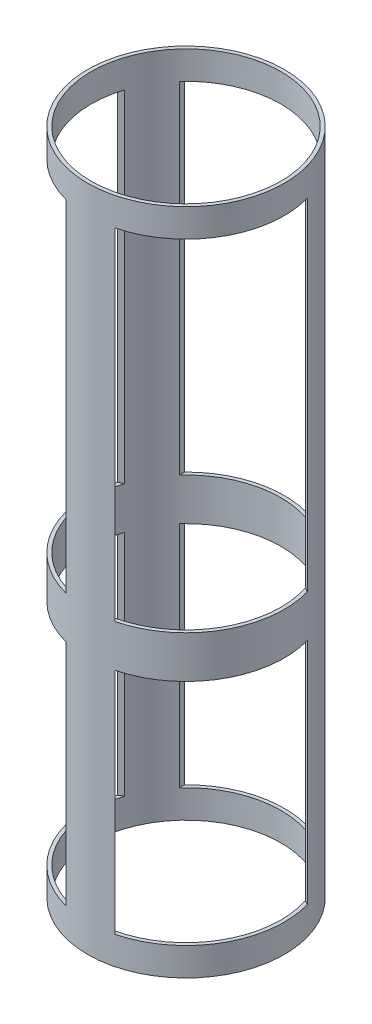
ISO-10303-21;
HEADER;
FILE_DESCRIPTION(('STEP AP214'),'2;1');
FILE_NAME('part.step','',(''),(''),'','','');
FILE_SCHEMA(('AUTOMOTIVE_DESIGN { 1 0 10303 214 1 1 1 1 }'));
ENDSEC;
DATA;
#1=APPLICATION_CONTEXT('core data for automotive mechanical design processes');
#2=APPLICATION_PROTOCOL_DEFINITION('international standard','automotive_design',2000,#1);
#3=PRODUCT_CONTEXT('',#1,'mechanical');
#4=PRODUCT('Part','Part','',(#3));
#5=PRODUCT_RELATED_PRODUCT_CATEGORY('part','',(#4));
#6=PRODUCT_DEFINITION_FORMATION('','',#4);
#7=PRODUCT_DEFINITION_CONTEXT('part definition',#1,'design');
#8=PRODUCT_DEFINITION('design','',#6,#7);
#9=PRODUCT_DEFINITION_SHAPE('','',#8);
#10=(LENGTH_UNIT() NAMED_UNIT(*) SI_UNIT(.MILLI.,.METRE.));
#11=(NAMED_UNIT(*) PLANE_ANGLE_UNIT() SI_UNIT($,.RADIAN.));
#12=(NAMED_UNIT(*) SI_UNIT($,.STERADIAN.) SOLID_ANGLE_UNIT());
#13=UNCERTAINTY_MEASURE_WITH_UNIT(LENGTH_MEASURE(1.E-05),#10,'distance_accuracy_value','');
#14=(GEOMETRIC_REPRESENTATION_CONTEXT(3) GLOBAL_UNCERTAINTY_ASSIGNED_CONTEXT((#13)) GLOBAL_UNIT_ASSIGNED_CONTEXT((#10,
#11,#12)) REPRESENTATION_CONTEXT('',''));
#15=CARTESIAN_POINT('',(0.,0.,0.));
#16=DIRECTION('',(0.,0.,1.));
#17=DIRECTION('',(1.,0.,0.));
#18=AXIS2_PLACEMENT_3D('',#15,#16,#17);
#19=CARTESIAN_POINT('',(0.,301.625,0.));
#20=DIRECTION('',(0.,1.,0.));
#21=DIRECTION('',(0.,0.,1.));
#22=AXIS2_PLACEMENT_3D('',#19,#20,#21);
#23=PLANE('',#22);
#24=CARTESIAN_POINT('',(0.,301.625,0.));
#25=DIRECTION('',(0.,1.,0.));
#26=DIRECTION('',(0.,0.,1.));
#27=AXIS2_PLACEMENT_3D('',#24,#25,#26);
#28=CIRCLE('',#27,88.9);
#29=CARTESIAN_POINT('',(0.,301.625,88.9));
#30=VERTEX_POINT('',#29);
#31=EDGE_CURVE('E384',#30,#30,#28,.T.);
#32=ORIENTED_EDGE('',*,*,#31,.T.);
#33=EDGE_LOOP('',(#32));
#34=FACE_BOUND('',#33,.T.);
#35=CARTESIAN_POINT('',(0.,301.625,0.));
#36=DIRECTION('',(0.,1.,0.));
#37=DIRECTION('',(0.,0.,1.));
#38=AXIS2_PLACEMENT_3D('',#35,#36,#37);
#39=CIRCLE('',#38,85.725);
#40=CARTESIAN_POINT('',(0.,301.625,85.725));
#41=VERTEX_POINT('',#40);
#42=EDGE_CURVE('E378',#41,#41,#39,.T.);
#43=ORIENTED_EDGE('',*,*,#42,.F.);
#44=EDGE_LOOP('',(#43));
#45=FACE_BOUND('',#44,.T.);
#46=ADVANCED_FACE('F45',(#34,#45),#23,.T.);
#47=CARTESIAN_POINT('',(0.,-301.625,0.));
#48=DIRECTION('',(0.,1.,0.));
#49=DIRECTION('',(0.,0.,1.));
#50=AXIS2_PLACEMENT_3D('',#47,#48,#49);
#51=PLANE('',#50);
#52=CARTESIAN_POINT('',(0.,-301.625,0.));
#53=DIRECTION('',(0.,1.,0.));
#54=DIRECTION('',(0.,0.,1.));
#55=AXIS2_PLACEMENT_3D('',#52,#53,#54);
#56=CIRCLE('',#55,88.9);
#57=CARTESIAN_POINT('',(0.,-301.625,88.9));
#58=VERTEX_POINT('',#57);
#59=EDGE_CURVE('E381',#58,#58,#56,.T.);
#60=ORIENTED_EDGE('',*,*,#59,.F.);
#61=EDGE_LOOP('',(#60));
#62=FACE_BOUND('',#61,.T.);
#63=CARTESIAN_POINT('',(0.,-301.625,0.));
#64=DIRECTION('',(0.,1.,0.));
#65=DIRECTION('',(0.,0.,1.));
#66=AXIS2_PLACEMENT_3D('',#63,#64,#65);
#67=CIRCLE('',#66,85.725);
#68=CARTESIAN_POINT('',(0.,-301.625,85.725));
#69=VERTEX_POINT('',#68);
#70=EDGE_CURVE('E336',#69,#69,#67,.T.);
#71=ORIENTED_EDGE('',*,*,#70,.T.);
#72=EDGE_LOOP('',(#71));
#73=FACE_BOUND('',#72,.T.);
#74=ADVANCED_FACE('F423',(#62,#73),#51,.F.);
#75=CARTESIAN_POINT('',(0.,301.625,0.));
#76=DIRECTION('',(0.,-1.,0.));
#77=DIRECTION('',(0.,0.,-1.));
#78=AXIS2_PLACEMENT_3D('',#75,#76,#77);
#79=CYLINDRICAL_SURFACE('',#78,88.9);
#80=CARTESIAN_POINT('',(0.,-31.623,0.));
#81=DIRECTION('',(0.,-1.,0.));
#82=DIRECTION('',(-0.500000000000004,0.,0.866025403784436));
#83=AXIS2_PLACEMENT_3D('',#80,#81,#82);
#84=CIRCLE('',#83,88.9);
#85=CARTESIAN_POINT('',(22.1315367264145,-31.623,86.1011328736583));
#86=VERTEX_POINT('',#85);
#87=CARTESIAN_POINT('',(85.631536726415,-31.623,-23.8840934069651));
#88=VERTEX_POINT('',#87);
#89=EDGE_CURVE('E238',#86,#88,#84,.F.);
#90=ORIENTED_EDGE('',*,*,#89,.F.);
#91=DIRECTION('',(0.,-1.,0.));
#92=VECTOR('',#91,1.);
#93=CARTESIAN_POINT('',(22.1315367264145,301.625,86.1011328736583));
#94=LINE('',#93,#92);
#95=CARTESIAN_POINT('',(22.1315367264145,276.225,86.1011328736583));
#96=VERTEX_POINT('',#95);
#97=EDGE_CURVE('E243',#96,#86,#94,.T.);
#98=ORIENTED_EDGE('',*,*,#97,.F.);
#99=CARTESIAN_POINT('',(0.,276.225,0.));
#100=DIRECTION('',(0.,1.,0.));
#101=DIRECTION('',(-0.866025403784436,0.,-0.500000000000004));
#102=AXIS2_PLACEMENT_3D('',#99,#100,#101);
#103=CIRCLE('',#102,88.9);
#104=CARTESIAN_POINT('',(85.631536726415,276.225,-23.8840934069651));
#105=VERTEX_POINT('',#104);
#106=EDGE_CURVE('E217',#105,#96,#103,.F.);
#107=ORIENTED_EDGE('',*,*,#106,.F.);
#108=DIRECTION('',(0.,-1.,0.));
#109=VECTOR('',#108,1.);
#110=CARTESIAN_POINT('',(85.631536726415,301.625,-23.8840934069651));
#111=LINE('',#110,#109);
#112=EDGE_CURVE('E60',#88,#105,#111,.F.);
#113=ORIENTED_EDGE('',*,*,#112,.F.);
#114=EDGE_LOOP('',(#90,#98,#107,#113));
#115=FACE_BOUND('',#114,.T.);
#116=CARTESIAN_POINT('',(0.,-31.623,0.));
#117=DIRECTION('',(0.,-1.,0.));
#118=DIRECTION('',(-0.499999999999992,0.,-0.866025403784443));
#119=AXIS2_PLACEMENT_3D('',#116,#117,#118);
#120=CIRCLE('',#119,88.9);
#121=CARTESIAN_POINT('',(-85.6315367264147,-31.623,-23.8840934069663));
#122=VERTEX_POINT('',#121);
#123=CARTESIAN_POINT('',(-22.1315367264157,-31.623,86.101132873658));
#124=VERTEX_POINT('',#123);
#125=EDGE_CURVE('E267',#122,#124,#120,.F.);
#126=ORIENTED_EDGE('',*,*,#125,.F.);
#127=DIRECTION('',(0.,-1.,0.));
#128=VECTOR('',#127,1.);
#129=CARTESIAN_POINT('',(-85.6315367264147,301.625,-23.8840934069663));
#130=LINE('',#129,#128);
#131=CARTESIAN_POINT('',(-85.6315367264147,276.225,-23.8840934069663));
#132=VERTEX_POINT('',#131);
#133=EDGE_CURVE('E218',#132,#122,#130,.T.);
#134=ORIENTED_EDGE('',*,*,#133,.F.);
#135=CARTESIAN_POINT('',(0.,276.225,0.));
#136=DIRECTION('',(0.,1.,0.));
#137=DIRECTION('',(0.866025403784443,0.,-0.499999999999992));
#138=AXIS2_PLACEMENT_3D('',#135,#136,#137);
#139=CIRCLE('',#138,88.9);
#140=CARTESIAN_POINT('',(-22.1315367264157,276.225,86.101132873658));
#141=VERTEX_POINT('',#140);
#142=EDGE_CURVE('E249',#141,#132,#139,.F.);
#143=ORIENTED_EDGE('',*,*,#142,.F.);
#144=DIRECTION('',(0.,-1.,0.));
#145=VECTOR('',#144,1.);
#146=CARTESIAN_POINT('',(-22.1315367264157,301.625,86.101132873658));
#147=LINE('',#146,#145);
#148=EDGE_CURVE('E68',#124,#141,#147,.F.);
#149=ORIENTED_EDGE('',*,*,#148,.F.);
#150=EDGE_LOOP('',(#126,#134,#143,#149));
#151=FACE_BOUND('',#150,.T.);
#152=CARTESIAN_POINT('',(0.,-276.225,0.));
#153=DIRECTION('',(0.,-1.,0.));
#154=DIRECTION('',(0.866025403784436,0.,0.500000000000004));
#155=AXIS2_PLACEMENT_3D('',#152,#153,#154);
#156=CIRCLE('',#155,88.9);
#157=CARTESIAN_POINT('',(22.1315367264145,-276.225,86.1011328736583));
#158=VERTEX_POINT('',#157);
#159=CARTESIAN_POINT('',(85.631536726415,-276.225,-23.8840934069651));
#160=VERTEX_POINT('',#159);
#161=EDGE_CURVE('E297',#158,#160,#156,.F.);
#162=ORIENTED_EDGE('',*,*,#161,.F.);
#163=DIRECTION('',(0.,-1.,0.));
#164=VECTOR('',#163,1.);
#165=CARTESIAN_POINT('',(22.1315367264145,301.625,86.1011328736583));
#166=LINE('',#165,#164);
#167=CARTESIAN_POINT('',(22.1315367264145,-69.723,86.1011328736583));
#168=VERTEX_POINT('',#167);
#169=EDGE_CURVE('E302',#168,#158,#166,.T.);
#170=ORIENTED_EDGE('',*,*,#169,.F.);
#171=CARTESIAN_POINT('',(0.,-69.723,0.));
#172=DIRECTION('',(0.,1.,0.));
#173=DIRECTION('',(0.500000000000004,0.,-0.866025403784436));
#174=AXIS2_PLACEMENT_3D('',#171,#172,#173);
#175=CIRCLE('',#174,88.9);
#176=CARTESIAN_POINT('',(85.631536726415,-69.723,-23.8840934069651));
#177=VERTEX_POINT('',#176);
#178=EDGE_CURVE('E276',#177,#168,#175,.F.);
#179=ORIENTED_EDGE('',*,*,#178,.F.);
#180=DIRECTION('',(0.,-1.,0.));
#181=VECTOR('',#180,1.);
#182=CARTESIAN_POINT('',(85.631536726415,301.625,-23.8840934069651));
#183=LINE('',#182,#181);
#184=EDGE_CURVE('E290',#160,#177,#183,.F.);
#185=ORIENTED_EDGE('',*,*,#184,.F.);
#186=EDGE_LOOP('',(#162,#170,#179,#185));
#187=FACE_BOUND('',#186,.T.);
#188=CARTESIAN_POINT('',(0.,-276.225,0.));
#189=DIRECTION('',(0.,-1.,0.));
#190=DIRECTION('',(-0.866025403784443,0.,0.499999999999992));
#191=AXIS2_PLACEMENT_3D('',#188,#189,#190);
#192=CIRCLE('',#191,88.9);
#193=CARTESIAN_POINT('',(-85.6315367264147,-276.225,-23.8840934069663));
#194=VERTEX_POINT('',#193);
#195=CARTESIAN_POINT('',(-22.1315367264157,-276.225,86.101132873658));
#196=VERTEX_POINT('',#195);
#197=EDGE_CURVE('E327',#194,#196,#192,.F.);
#198=ORIENTED_EDGE('',*,*,#197,.F.);
#199=DIRECTION('',(0.,-1.,0.));
#200=VECTOR('',#199,1.);
#201=CARTESIAN_POINT('',(-85.6315367264147,301.625,-23.8840934069663));
#202=LINE('',#201,#200);
#203=CARTESIAN_POINT('',(-85.6315367264147,-69.723,-23.8840934069663));
#204=VERTEX_POINT('',#203);
#205=EDGE_CURVE('E277',#204,#194,#202,.T.);
#206=ORIENTED_EDGE('',*,*,#205,.F.);
#207=CARTESIAN_POINT('',(0.,-69.723,0.));
#208=DIRECTION('',(0.,1.,0.));
#209=DIRECTION('',(0.499999999999992,0.,0.866025403784443));
#210=AXIS2_PLACEMENT_3D('',#207,#208,#209);
#211=CIRCLE('',#210,88.9);
#212=CARTESIAN_POINT('',(-22.1315367264157,-69.723,86.101132873658));
#213=VERTEX_POINT('',#212);
#214=EDGE_CURVE('E307',#213,#204,#211,.F.);
#215=ORIENTED_EDGE('',*,*,#214,.F.);
#216=DIRECTION('',(0.,-1.,0.));
#217=VECTOR('',#216,1.);
#218=CARTESIAN_POINT('',(-22.1315367264157,301.625,86.101132873658));
#219=LINE('',#218,#217);
#220=EDGE_CURVE('E320',#196,#213,#219,.F.);
#221=ORIENTED_EDGE('',*,*,#220,.F.);
#222=EDGE_LOOP('',(#198,#206,#215,#221));
#223=FACE_BOUND('',#222,.T.);
#224=CARTESIAN_POINT('',(0.,-276.225,0.));
#225=DIRECTION('',(0.,-1.,0.));
#226=DIRECTION('',(0.,0.,-1.));
#227=AXIS2_PLACEMENT_3D('',#224,#225,#226);
#228=CIRCLE('',#227,88.9);
#229=CARTESIAN_POINT('',(63.5,-276.225,-62.2170394666927));
#230=VERTEX_POINT('',#229);
#231=CARTESIAN_POINT('',(-63.5,-276.225,-62.2170394666927));
#232=VERTEX_POINT('',#231);
#233=EDGE_CURVE('E337',#230,#232,#228,.F.);
#234=ORIENTED_EDGE('',*,*,#233,.F.);
#235=DIRECTION('',(0.,-1.,0.));
#236=VECTOR('',#235,1.);
#237=CARTESIAN_POINT('',(63.5,301.625,-62.2170394666927));
#238=LINE('',#237,#236);
#239=CARTESIAN_POINT('',(63.5,-69.723,-62.2170394666927));
#240=VERTEX_POINT('',#239);
#241=EDGE_CURVE('E340',#240,#230,#238,.T.);
#242=ORIENTED_EDGE('',*,*,#241,.F.);
#243=CARTESIAN_POINT('',(0.,-69.723,0.));
#244=DIRECTION('',(0.,1.,0.));
#245=DIRECTION('',(-1.,0.,0.));
#246=AXIS2_PLACEMENT_3D('',#243,#244,#245);
#247=CIRCLE('',#246,88.9);
#248=CARTESIAN_POINT('',(-63.5,-69.723,-62.2170394666927));
#249=VERTEX_POINT('',#248);
#250=EDGE_CURVE('E343',#249,#240,#247,.F.);
#251=ORIENTED_EDGE('',*,*,#250,.F.);
#252=DIRECTION('',(0.,-1.,0.));
#253=VECTOR('',#252,1.);
#254=CARTESIAN_POINT('',(-63.5,301.625,-62.2170394666927));
#255=LINE('',#254,#253);
#256=EDGE_CURVE('E334',#232,#249,#255,.F.);
#257=ORIENTED_EDGE('',*,*,#256,.F.);
#258=EDGE_LOOP('',(#234,#242,#251,#257));
#259=FACE_BOUND('',#258,.T.);
#260=CARTESIAN_POINT('',(0.,-31.623,0.));
#261=DIRECTION('',(0.,-1.,0.));
#262=DIRECTION('',(1.,0.,0.));
#263=AXIS2_PLACEMENT_3D('',#260,#261,#262);
#264=CIRCLE('',#263,88.9);
#265=CARTESIAN_POINT('',(63.5,-31.623,-62.2170394666927));
#266=VERTEX_POINT('',#265);
#267=CARTESIAN_POINT('',(-63.5,-31.623,-62.2170394666927));
#268=VERTEX_POINT('',#267);
#269=EDGE_CURVE('E359',#266,#268,#264,.F.);
#270=ORIENTED_EDGE('',*,*,#269,.F.);
#271=DIRECTION('',(0.,-1.,0.));
#272=VECTOR('',#271,1.);
#273=CARTESIAN_POINT('',(63.5,301.625,-62.2170394666927));
#274=LINE('',#273,#272);
#275=CARTESIAN_POINT('',(63.5,276.225,-62.2170394666927));
#276=VERTEX_POINT('',#275);
#277=EDGE_CURVE('E362',#276,#266,#274,.T.);
#278=ORIENTED_EDGE('',*,*,#277,.F.);
#279=CARTESIAN_POINT('',(0.,276.225,0.));
#280=DIRECTION('',(0.,1.,0.));
#281=DIRECTION('',(0.,0.,1.));
#282=AXIS2_PLACEMENT_3D('',#279,#280,#281);
#283=CIRCLE('',#282,88.9);
#284=CARTESIAN_POINT('',(-63.5,276.225,-62.2170394666927));
#285=VERTEX_POINT('',#284);
#286=EDGE_CURVE('E365',#285,#276,#283,.F.);
#287=ORIENTED_EDGE('',*,*,#286,.F.);
#288=DIRECTION('',(0.,-1.,0.));
#289=VECTOR('',#288,1.);
#290=CARTESIAN_POINT('',(-63.5,301.625,-62.2170394666927));
#291=LINE('',#290,#289);
#292=EDGE_CURVE('E357',#268,#285,#291,.F.);
#293=ORIENTED_EDGE('',*,*,#292,.F.);
#294=EDGE_LOOP('',(#270,#278,#287,#293));
#295=FACE_BOUND('',#294,.T.);
#296=ORIENTED_EDGE('',*,*,#31,.F.);
#297=EDGE_LOOP('',(#296));
#298=FACE_BOUND('',#297,.T.);
#299=ORIENTED_EDGE('',*,*,#59,.T.);
#300=EDGE_LOOP('',(#299));
#301=FACE_BOUND('',#300,.T.);
#302=ADVANCED_FACE('F47',(#115,#151,#187,#223,#259,#295,#298,#301),#79,.T.);
#303=CARTESIAN_POINT('',(0.,301.625,0.));
#304=DIRECTION('',(0.,-1.,0.));
#305=DIRECTION('',(0.,0.,-1.));
#306=AXIS2_PLACEMENT_3D('',#303,#304,#305);
#307=CYLINDRICAL_SURFACE('',#306,85.725);
#308=DIRECTION('',(0.,-1.,0.));
#309=VECTOR('',#308,1.);
#310=CARTESIAN_POINT('',(18.1237828798855,301.625,83.787255111519));
#311=LINE('',#310,#309);
#312=CARTESIAN_POINT('',(18.1237828798855,-31.623,83.787255111519));
#313=VERTEX_POINT('',#312);
#314=CARTESIAN_POINT('',(18.1237828798855,276.225,83.787255111519));
#315=VERTEX_POINT('',#314);
#316=EDGE_CURVE('E241',#313,#315,#311,.F.);
#317=ORIENTED_EDGE('',*,*,#316,.F.);
#318=CARTESIAN_POINT('',(0.,-31.623,0.));
#319=DIRECTION('',(0.,-1.,0.));
#320=DIRECTION('',(-0.500000000000004,0.,0.866025403784436));
#321=AXIS2_PLACEMENT_3D('',#318,#319,#320);
#322=CIRCLE('',#321,85.725);
#323=CARTESIAN_POINT('',(81.623782879886,-31.623,-26.1979711691044));
#324=VERTEX_POINT('',#323);
#325=EDGE_CURVE('E227',#324,#313,#322,.T.);
#326=ORIENTED_EDGE('',*,*,#325,.F.);
#327=DIRECTION('',(0.,-1.,0.));
#328=VECTOR('',#327,1.);
#329=CARTESIAN_POINT('',(81.623782879886,301.625,-26.1979711691044));
#330=LINE('',#329,#328);
#331=CARTESIAN_POINT('',(81.623782879886,276.225,-26.1979711691044));
#332=VERTEX_POINT('',#331);
#333=EDGE_CURVE('E221',#332,#324,#330,.T.);
#334=ORIENTED_EDGE('',*,*,#333,.F.);
#335=CARTESIAN_POINT('',(0.,276.225,0.));
#336=DIRECTION('',(0.,1.,0.));
#337=DIRECTION('',(-0.866025403784436,0.,-0.500000000000004));
#338=AXIS2_PLACEMENT_3D('',#335,#336,#337);
#339=CIRCLE('',#338,85.725);
#340=EDGE_CURVE('E208',#315,#332,#339,.T.);
#341=ORIENTED_EDGE('',*,*,#340,.F.);
#342=EDGE_LOOP('',(#317,#326,#334,#341));
#343=FACE_BOUND('',#342,.T.);
#344=DIRECTION('',(0.,-1.,0.));
#345=VECTOR('',#344,1.);
#346=CARTESIAN_POINT('',(-81.6237828798856,301.625,-26.1979711691055));
#347=LINE('',#346,#345);
#348=CARTESIAN_POINT('',(-81.6237828798856,-31.623,-26.1979711691055));
#349=VERTEX_POINT('',#348);
#350=CARTESIAN_POINT('',(-81.6237828798857,276.225,-26.1979711691055));
#351=VERTEX_POINT('',#350);
#352=EDGE_CURVE('E270',#349,#351,#347,.F.);
#353=ORIENTED_EDGE('',*,*,#352,.F.);
#354=CARTESIAN_POINT('',(0.,-31.623,0.));
#355=DIRECTION('',(0.,-1.,0.));
#356=DIRECTION('',(-0.499999999999992,0.,-0.866025403784443));
#357=AXIS2_PLACEMENT_3D('',#354,#355,#356);
#358=CIRCLE('',#357,85.725);
#359=CARTESIAN_POINT('',(-18.1237828798867,-31.623,83.7872551115188));
#360=VERTEX_POINT('',#359);
#361=EDGE_CURVE('E262',#360,#349,#358,.T.);
#362=ORIENTED_EDGE('',*,*,#361,.F.);
#363=DIRECTION('',(0.,-1.,0.));
#364=VECTOR('',#363,1.);
#365=CARTESIAN_POINT('',(-18.1237828798867,301.625,83.7872551115187));
#366=LINE('',#365,#364);
#367=CARTESIAN_POINT('',(-18.1237828798867,276.225,83.7872551115187));
#368=VERTEX_POINT('',#367);
#369=EDGE_CURVE('E256',#368,#360,#366,.T.);
#370=ORIENTED_EDGE('',*,*,#369,.F.);
#371=CARTESIAN_POINT('',(0.,276.225,0.));
#372=DIRECTION('',(0.,1.,0.));
#373=DIRECTION('',(0.866025403784443,0.,-0.499999999999992));
#374=AXIS2_PLACEMENT_3D('',#371,#372,#373);
#375=CIRCLE('',#374,85.725);
#376=EDGE_CURVE('E247',#351,#368,#375,.T.);
#377=ORIENTED_EDGE('',*,*,#376,.F.);
#378=EDGE_LOOP('',(#353,#362,#370,#377));
#379=FACE_BOUND('',#378,.T.);
#380=DIRECTION('',(0.,-1.,0.));
#381=VECTOR('',#380,1.);
#382=CARTESIAN_POINT('',(18.1237828798855,301.625,83.787255111519));
#383=LINE('',#382,#381);
#384=CARTESIAN_POINT('',(18.1237828798855,-276.225,83.787255111519));
#385=VERTEX_POINT('',#384);
#386=CARTESIAN_POINT('',(18.1237828798855,-69.723,83.787255111519));
#387=VERTEX_POINT('',#386);
#388=EDGE_CURVE('E300',#385,#387,#383,.F.);
#389=ORIENTED_EDGE('',*,*,#388,.F.);
#390=CARTESIAN_POINT('',(0.,-276.225,0.));
#391=DIRECTION('',(0.,-1.,0.));
#392=DIRECTION('',(0.866025403784436,0.,0.500000000000004));
#393=AXIS2_PLACEMENT_3D('',#390,#391,#392);
#394=CIRCLE('',#393,85.725);
#395=CARTESIAN_POINT('',(81.623782879886,-276.225,-26.1979711691044));
#396=VERTEX_POINT('',#395);
#397=EDGE_CURVE('E292',#396,#385,#394,.T.);
#398=ORIENTED_EDGE('',*,*,#397,.F.);
#399=DIRECTION('',(0.,-1.,0.));
#400=VECTOR('',#399,1.);
#401=CARTESIAN_POINT('',(81.623782879886,301.625,-26.1979711691044));
#402=LINE('',#401,#400);
#403=CARTESIAN_POINT('',(81.623782879886,-69.723,-26.1979711691044));
#404=VERTEX_POINT('',#403);
#405=EDGE_CURVE('E285',#404,#396,#402,.T.);
#406=ORIENTED_EDGE('',*,*,#405,.F.);
#407=CARTESIAN_POINT('',(0.,-69.723,0.));
#408=DIRECTION('',(0.,1.,0.));
#409=DIRECTION('',(0.500000000000004,0.,-0.866025403784436));
#410=AXIS2_PLACEMENT_3D('',#407,#408,#409);
#411=CIRCLE('',#410,85.725);
#412=EDGE_CURVE('E274',#387,#404,#411,.T.);
#413=ORIENTED_EDGE('',*,*,#412,.F.);
#414=EDGE_LOOP('',(#389,#398,#406,#413));
#415=FACE_BOUND('',#414,.T.);
#416=DIRECTION('',(0.,-1.,0.));
#417=VECTOR('',#416,1.);
#418=CARTESIAN_POINT('',(-81.6237828798856,301.625,-26.1979711691055));
#419=LINE('',#418,#417);
#420=CARTESIAN_POINT('',(-81.6237828798856,-276.225,-26.1979711691055));
#421=VERTEX_POINT('',#420);
#422=CARTESIAN_POINT('',(-81.6237828798857,-69.723,-26.1979711691055));
#423=VERTEX_POINT('',#422);
#424=EDGE_CURVE('E330',#421,#423,#419,.F.);
#425=ORIENTED_EDGE('',*,*,#424,.F.);
#426=CARTESIAN_POINT('',(0.,-276.225,0.));
#427=DIRECTION('',(0.,-1.,0.));
#428=DIRECTION('',(-0.866025403784443,0.,0.499999999999992));
#429=AXIS2_PLACEMENT_3D('',#426,#427,#428);
#430=CIRCLE('',#429,85.725);
#431=CARTESIAN_POINT('',(-18.1237828798867,-276.225,83.7872551115187));
#432=VERTEX_POINT('',#431);
#433=EDGE_CURVE('E322',#432,#421,#430,.T.);
#434=ORIENTED_EDGE('',*,*,#433,.F.);
#435=DIRECTION('',(0.,-1.,0.));
#436=VECTOR('',#435,1.);
#437=CARTESIAN_POINT('',(-18.1237828798867,301.625,83.7872551115187));
#438=LINE('',#437,#436);
#439=CARTESIAN_POINT('',(-18.1237828798867,-69.723,83.7872551115187));
#440=VERTEX_POINT('',#439);
#441=EDGE_CURVE('E315',#440,#432,#438,.T.);
#442=ORIENTED_EDGE('',*,*,#441,.F.);
#443=CARTESIAN_POINT('',(0.,-69.723,0.));
#444=DIRECTION('',(0.,1.,0.));
#445=DIRECTION('',(0.499999999999992,0.,0.866025403784443));
#446=AXIS2_PLACEMENT_3D('',#443,#444,#445);
#447=CIRCLE('',#446,85.725);
#448=EDGE_CURVE('E246',#423,#440,#447,.T.);
#449=ORIENTED_EDGE('',*,*,#448,.F.);
#450=EDGE_LOOP('',(#425,#434,#442,#449));
#451=FACE_BOUND('',#450,.T.);
#452=DIRECTION('',(0.,-1.,0.));
#453=VECTOR('',#452,1.);
#454=CARTESIAN_POINT('',(63.5,301.625,-57.5892839424141));
#455=LINE('',#454,#453);
#456=CARTESIAN_POINT('',(63.5,-276.225,-57.5892839424141));
#457=VERTEX_POINT('',#456);
#458=CARTESIAN_POINT('',(63.5,-69.723,-57.5892839424141));
#459=VERTEX_POINT('',#458);
#460=EDGE_CURVE('E11',#457,#459,#455,.F.);
#461=ORIENTED_EDGE('',*,*,#460,.F.);
#462=CARTESIAN_POINT('',(0.,-276.225,0.));
#463=DIRECTION('',(0.,-1.,0.));
#464=DIRECTION('',(0.,0.,-1.));
#465=AXIS2_PLACEMENT_3D('',#462,#463,#464);
#466=CIRCLE('',#465,85.725);
#467=CARTESIAN_POINT('',(-63.5,-276.225,-57.5892839424141));
#468=VERTEX_POINT('',#467);
#469=EDGE_CURVE('E53',#468,#457,#466,.T.);
#470=ORIENTED_EDGE('',*,*,#469,.F.);
#471=DIRECTION('',(0.,-1.,0.));
#472=VECTOR('',#471,1.);
#473=CARTESIAN_POINT('',(-63.5,301.625,-57.5892839424141));
#474=LINE('',#473,#472);
#475=CARTESIAN_POINT('',(-63.5,-69.723,-57.5892839424141));
#476=VERTEX_POINT('',#475);
#477=EDGE_CURVE('E400',#476,#468,#474,.T.);
#478=ORIENTED_EDGE('',*,*,#477,.F.);
#479=CARTESIAN_POINT('',(0.,-69.723,0.));
#480=DIRECTION('',(0.,1.,0.));
#481=DIRECTION('',(-1.,0.,0.));
#482=AXIS2_PLACEMENT_3D('',#479,#480,#481);
#483=CIRCLE('',#482,85.725);
#484=EDGE_CURVE('E398',#459,#476,#483,.T.);
#485=ORIENTED_EDGE('',*,*,#484,.F.);
#486=EDGE_LOOP('',(#461,#470,#478,#485));
#487=FACE_BOUND('',#486,.T.);
#488=DIRECTION('',(0.,-1.,0.));
#489=VECTOR('',#488,1.);
#490=CARTESIAN_POINT('',(63.5,301.625,-57.5892839424141));
#491=LINE('',#490,#489);
#492=CARTESIAN_POINT('',(63.5,-31.623,-57.5892839424141));
#493=VERTEX_POINT('',#492);
#494=CARTESIAN_POINT('',(63.5,276.225,-57.5892839424141));
#495=VERTEX_POINT('',#494);
#496=EDGE_CURVE('E395',#493,#495,#491,.F.);
#497=ORIENTED_EDGE('',*,*,#496,.F.);
#498=CARTESIAN_POINT('',(0.,-31.623,0.));
#499=DIRECTION('',(0.,-1.,0.));
#500=DIRECTION('',(1.,0.,0.));
#501=AXIS2_PLACEMENT_3D('',#498,#499,#500);
#502=CIRCLE('',#501,85.725);
#503=CARTESIAN_POINT('',(-63.5,-31.623,-57.5892839424141));
#504=VERTEX_POINT('',#503);
#505=EDGE_CURVE('E393',#504,#493,#502,.T.);
#506=ORIENTED_EDGE('',*,*,#505,.F.);
#507=DIRECTION('',(0.,-1.,0.));
#508=VECTOR('',#507,1.);
#509=CARTESIAN_POINT('',(-63.5,301.625,-57.5892839424141));
#510=LINE('',#509,#508);
#511=CARTESIAN_POINT('',(-63.5,276.225,-57.5892839424141));
#512=VERTEX_POINT('',#511);
#513=EDGE_CURVE('E391',#512,#504,#510,.T.);
#514=ORIENTED_EDGE('',*,*,#513,.F.);
#515=CARTESIAN_POINT('',(0.,276.225,0.));
#516=DIRECTION('',(0.,1.,0.));
#517=DIRECTION('',(0.,0.,1.));
#518=AXIS2_PLACEMENT_3D('',#515,#516,#517);
#519=CIRCLE('',#518,85.725);
#520=EDGE_CURVE('E387',#495,#512,#519,.T.);
#521=ORIENTED_EDGE('',*,*,#520,.F.);
#522=EDGE_LOOP('',(#497,#506,#514,#521));
#523=FACE_BOUND('',#522,.T.);
#524=ORIENTED_EDGE('',*,*,#42,.T.);
#525=EDGE_LOOP('',(#524));
#526=FACE_BOUND('',#525,.T.);
#527=ORIENTED_EDGE('',*,*,#70,.F.);
#528=EDGE_LOOP('',(#527));
#529=FACE_BOUND('',#528,.T.);
#530=ADVANCED_FACE('F225',(#343,#379,#415,#451,#487,#523,#526,#529),#307,.F.);
#531=CARTESIAN_POINT('',(63.5,-31.623,-88.901));
#532=DIRECTION('',(1.,0.,0.));
#533=DIRECTION('',(0.,1.,0.));
#534=AXIS2_PLACEMENT_3D('',#531,#532,#533);
#535=PLANE('',#534);
#536=ORIENTED_EDGE('',*,*,#496,.T.);
#537=DIRECTION('',(0.,0.,1.));
#538=VECTOR('',#537,1.);
#539=CARTESIAN_POINT('',(63.5,276.225,-88.901));
#540=LINE('',#539,#538);
#541=EDGE_CURVE('E305',#276,#495,#540,.T.);
#542=ORIENTED_EDGE('',*,*,#541,.F.);
#543=ORIENTED_EDGE('',*,*,#277,.T.);
#544=DIRECTION('',(0.,0.,1.));
#545=VECTOR('',#544,1.);
#546=CARTESIAN_POINT('',(63.5,-31.623,-88.901));
#547=LINE('',#546,#545);
#548=EDGE_CURVE('E369',#266,#493,#547,.T.);
#549=ORIENTED_EDGE('',*,*,#548,.T.);
#550=EDGE_LOOP('',(#536,#542,#543,#549));
#551=FACE_BOUND('',#550,.T.);
#552=ADVANCED_FACE('F438',(#551),#535,.F.);
#553=CARTESIAN_POINT('',(63.5,-31.623,-88.901));
#554=DIRECTION('',(0.,-1.,0.));
#555=DIRECTION('',(1.,0.,0.));
#556=AXIS2_PLACEMENT_3D('',#553,#554,#555);
#557=PLANE('',#556);
#558=ORIENTED_EDGE('',*,*,#505,.T.);
#559=ORIENTED_EDGE('',*,*,#548,.F.);
#560=ORIENTED_EDGE('',*,*,#269,.T.);
#561=DIRECTION('',(0.,0.,1.));
#562=VECTOR('',#561,1.);
#563=CARTESIAN_POINT('',(-63.5,-31.623,-88.901));
#564=LINE('',#563,#562);
#565=EDGE_CURVE('E372',#268,#504,#564,.T.);
#566=ORIENTED_EDGE('',*,*,#565,.T.);
#567=EDGE_LOOP('',(#558,#559,#560,#566));
#568=FACE_BOUND('',#567,.T.);
#569=ADVANCED_FACE('F443',(#568),#557,.F.);
#570=CARTESIAN_POINT('',(-63.5,-31.623,-88.901));
#571=DIRECTION('',(-1.,0.,0.));
#572=DIRECTION('',(0.,-1.,0.));
#573=AXIS2_PLACEMENT_3D('',#570,#571,#572);
#574=PLANE('',#573);
#575=ORIENTED_EDGE('',*,*,#513,.T.);
#576=ORIENTED_EDGE('',*,*,#565,.F.);
#577=ORIENTED_EDGE('',*,*,#292,.T.);
#578=DIRECTION('',(0.,0.,1.));
#579=VECTOR('',#578,1.);
#580=CARTESIAN_POINT('',(-63.5,276.225,-88.901));
#581=LINE('',#580,#579);
#582=EDGE_CURVE('E368',#285,#512,#581,.T.);
#583=ORIENTED_EDGE('',*,*,#582,.T.);
#584=EDGE_LOOP('',(#575,#576,#577,#583));
#585=FACE_BOUND('',#584,.T.);
#586=ADVANCED_FACE('F686',(#585),#574,.F.);
#587=CARTESIAN_POINT('',(63.5,276.225,-88.901));
#588=DIRECTION('',(0.,1.,0.));
#589=DIRECTION('',(0.,0.,1.));
#590=AXIS2_PLACEMENT_3D('',#587,#588,#589);
#591=PLANE('',#590);
#592=ORIENTED_EDGE('',*,*,#520,.T.);
#593=ORIENTED_EDGE('',*,*,#582,.F.);
#594=ORIENTED_EDGE('',*,*,#286,.T.);
#595=ORIENTED_EDGE('',*,*,#541,.T.);
#596=EDGE_LOOP('',(#592,#593,#594,#595));
#597=FACE_BOUND('',#596,.T.);
#598=ADVANCED_FACE('F679',(#597),#591,.F.);
#599=CARTESIAN_POINT('',(63.5,-276.225,-88.901));
#600=DIRECTION('',(1.,0.,0.));
#601=DIRECTION('',(0.,0.,-1.));
#602=AXIS2_PLACEMENT_3D('',#599,#600,#601);
#603=PLANE('',#602);
#604=ORIENTED_EDGE('',*,*,#460,.T.);
#605=DIRECTION('',(0.,0.,1.));
#606=VECTOR('',#605,1.);
#607=CARTESIAN_POINT('',(63.5,-69.723,-88.901));
#608=LINE('',#607,#606);
#609=EDGE_CURVE('E351',#240,#459,#608,.T.);
#610=ORIENTED_EDGE('',*,*,#609,.F.);
#611=ORIENTED_EDGE('',*,*,#241,.T.);
#612=DIRECTION('',(0.,0.,1.));
#613=VECTOR('',#612,1.);
#614=CARTESIAN_POINT('',(63.5,-276.225,-88.901));
#615=LINE('',#614,#613);
#616=EDGE_CURVE('E347',#230,#457,#615,.T.);
#617=ORIENTED_EDGE('',*,*,#616,.T.);
#618=EDGE_LOOP('',(#604,#610,#611,#617));
#619=FACE_BOUND('',#618,.T.);
#620=ADVANCED_FACE('F408',(#619),#603,.F.);
#621=CARTESIAN_POINT('',(63.5,-276.225,-88.901));
#622=DIRECTION('',(0.,-1.,0.));
#623=DIRECTION('',(0.,0.,-1.));
#624=AXIS2_PLACEMENT_3D('',#621,#622,#623);
#625=PLANE('',#624);
#626=ORIENTED_EDGE('',*,*,#469,.T.);
#627=ORIENTED_EDGE('',*,*,#616,.F.);
#628=ORIENTED_EDGE('',*,*,#233,.T.);
#629=DIRECTION('',(0.,0.,1.));
#630=VECTOR('',#629,1.);
#631=CARTESIAN_POINT('',(-63.5,-276.225,-88.901));
#632=LINE('',#631,#630);
#633=EDGE_CURVE('E350',#232,#468,#632,.T.);
#634=ORIENTED_EDGE('',*,*,#633,.T.);
#635=EDGE_LOOP('',(#626,#627,#628,#634));
#636=FACE_BOUND('',#635,.T.);
#637=ADVANCED_FACE('F403',(#636),#625,.F.);
#638=CARTESIAN_POINT('',(-63.5,-276.225,-88.901));
#639=DIRECTION('',(-1.,0.,0.));
#640=DIRECTION('',(0.,0.,1.));
#641=AXIS2_PLACEMENT_3D('',#638,#639,#640);
#642=PLANE('',#641);
#643=ORIENTED_EDGE('',*,*,#477,.T.);
#644=ORIENTED_EDGE('',*,*,#633,.F.);
#645=ORIENTED_EDGE('',*,*,#256,.T.);
#646=DIRECTION('',(0.,0.,1.));
#647=VECTOR('',#646,1.);
#648=CARTESIAN_POINT('',(-63.5,-69.723,-88.901));
#649=LINE('',#648,#647);
#650=EDGE_CURVE('E346',#249,#476,#649,.T.);
#651=ORIENTED_EDGE('',*,*,#650,.T.);
#652=EDGE_LOOP('',(#643,#644,#645,#651));
#653=FACE_BOUND('',#652,.T.);
#654=ADVANCED_FACE('F418',(#653),#642,.F.);
#655=CARTESIAN_POINT('',(63.5,-69.723,-88.901));
#656=DIRECTION('',(0.,1.,0.));
#657=DIRECTION('',(-1.,0.,0.));
#658=AXIS2_PLACEMENT_3D('',#655,#656,#657);
#659=PLANE('',#658);
#660=ORIENTED_EDGE('',*,*,#484,.T.);
#661=ORIENTED_EDGE('',*,*,#650,.F.);
#662=ORIENTED_EDGE('',*,*,#250,.T.);
#663=ORIENTED_EDGE('',*,*,#609,.T.);
#664=EDGE_LOOP('',(#660,#661,#662,#663));
#665=FACE_BOUND('',#664,.T.);
#666=ADVANCED_FACE('F415',(#665),#659,.F.);
#667=CARTESIAN_POINT('',(-108.74052442184,-276.225,-10.5421131403129));
#668=DIRECTION('',(-0.499999999999992,0.,-0.866025403784443));
#669=DIRECTION('',(-0.866025403784443,0.,0.499999999999992));
#670=AXIS2_PLACEMENT_3D('',#667,#668,#669);
#671=PLANE('',#670);
#672=ORIENTED_EDGE('',*,*,#424,.T.);
#673=DIRECTION('',(0.866025403784443,0.,-0.499999999999992));
#674=VECTOR('',#673,1.);
#675=CARTESIAN_POINT('',(-108.74052442184,-69.723,-10.5421131403129));
#676=LINE('',#675,#674);
#677=EDGE_CURVE('E312',#204,#423,#676,.T.);
#678=ORIENTED_EDGE('',*,*,#677,.F.);
#679=ORIENTED_EDGE('',*,*,#205,.T.);
#680=DIRECTION('',(0.866025403784443,0.,-0.499999999999992));
#681=VECTOR('',#680,1.);
#682=CARTESIAN_POINT('',(-108.74052442184,-276.225,-10.5421131403129));
#683=LINE('',#682,#681);
#684=EDGE_CURVE('E324',#194,#421,#683,.T.);
#685=ORIENTED_EDGE('',*,*,#684,.T.);
#686=EDGE_LOOP('',(#672,#678,#679,#685));
#687=FACE_BOUND('',#686,.T.);
#688=ADVANCED_FACE('F471',(#687),#671,.F.);
#689=CARTESIAN_POINT('',(-108.74052442184,-276.225,-10.5421131403129));
#690=DIRECTION('',(0.,-1.,0.));
#691=DIRECTION('',(-0.866025403784443,0.,0.499999999999992));
#692=AXIS2_PLACEMENT_3D('',#689,#690,#691);
#693=PLANE('',#692);
#694=ORIENTED_EDGE('',*,*,#433,.T.);
#695=ORIENTED_EDGE('',*,*,#684,.F.);
#696=ORIENTED_EDGE('',*,*,#197,.T.);
#697=DIRECTION('',(0.866025403784443,0.,-0.499999999999992));
#698=VECTOR('',#697,1.);
#699=CARTESIAN_POINT('',(-45.2405244218413,-276.225,99.4431131403114));
#700=LINE('',#699,#698);
#701=EDGE_CURVE('E317',#196,#432,#700,.T.);
#702=ORIENTED_EDGE('',*,*,#701,.T.);
#703=EDGE_LOOP('',(#694,#695,#696,#702));
#704=FACE_BOUND('',#703,.T.);
#705=ADVANCED_FACE('F477',(#704),#693,.F.);
#706=CARTESIAN_POINT('',(-45.2405244218413,-276.225,99.4431131403114));
#707=DIRECTION('',(0.499999999999992,0.,0.866025403784443));
#708=DIRECTION('',(0.866025403784443,0.,-0.499999999999992));
#709=AXIS2_PLACEMENT_3D('',#706,#707,#708);
#710=PLANE('',#709);
#711=ORIENTED_EDGE('',*,*,#441,.T.);
#712=ORIENTED_EDGE('',*,*,#701,.F.);
#713=ORIENTED_EDGE('',*,*,#220,.T.);
#714=DIRECTION('',(0.866025403784443,0.,-0.499999999999992));
#715=VECTOR('',#714,1.);
#716=CARTESIAN_POINT('',(-45.2405244218413,-69.723,99.4431131403114));
#717=LINE('',#716,#715);
#718=EDGE_CURVE('E309',#213,#440,#717,.T.);
#719=ORIENTED_EDGE('',*,*,#718,.T.);
#720=EDGE_LOOP('',(#711,#712,#713,#719));
#721=FACE_BOUND('',#720,.T.);
#722=ADVANCED_FACE('F491',(#721),#710,.F.);
#723=CARTESIAN_POINT('',(-108.74052442184,-69.723,-10.5421131403129));
#724=DIRECTION('',(0.,1.,0.));
#725=DIRECTION('',(0.499999999999992,0.,0.866025403784443));
#726=AXIS2_PLACEMENT_3D('',#723,#724,#725);
#727=PLANE('',#726);
#728=ORIENTED_EDGE('',*,*,#448,.T.);
#729=ORIENTED_EDGE('',*,*,#718,.F.);
#730=ORIENTED_EDGE('',*,*,#214,.T.);
#731=ORIENTED_EDGE('',*,*,#677,.T.);
#732=EDGE_LOOP('',(#728,#729,#730,#731));
#733=FACE_BOUND('',#732,.T.);
#734=ADVANCED_FACE('F503',(#733),#727,.F.);
#735=CARTESIAN_POINT('',(45.2405244218399,-276.225,99.4431131403121));
#736=DIRECTION('',(-0.500000000000004,0.,0.866025403784436));
#737=DIRECTION('',(0.866025403784436,0.,0.500000000000004));
#738=AXIS2_PLACEMENT_3D('',#735,#736,#737);
#739=PLANE('',#738);
#740=ORIENTED_EDGE('',*,*,#388,.T.);
#741=DIRECTION('',(-0.866025403784436,0.,-0.500000000000004));
#742=VECTOR('',#741,1.);
#743=CARTESIAN_POINT('',(45.2405244218399,-69.723,99.4431131403121));
#744=LINE('',#743,#742);
#745=EDGE_CURVE('E282',#168,#387,#744,.T.);
#746=ORIENTED_EDGE('',*,*,#745,.F.);
#747=ORIENTED_EDGE('',*,*,#169,.T.);
#748=DIRECTION('',(-0.866025403784436,0.,-0.500000000000004));
#749=VECTOR('',#748,1.);
#750=CARTESIAN_POINT('',(45.2405244218399,-276.225,99.4431131403121));
#751=LINE('',#750,#749);
#752=EDGE_CURVE('E294',#158,#385,#751,.T.);
#753=ORIENTED_EDGE('',*,*,#752,.T.);
#754=EDGE_LOOP('',(#740,#746,#747,#753));
#755=FACE_BOUND('',#754,.T.);
#756=ADVANCED_FACE('F515',(#755),#739,.F.);
#757=CARTESIAN_POINT('',(45.2405244218399,-276.225,99.4431131403121));
#758=DIRECTION('',(0.,-1.,0.));
#759=DIRECTION('',(0.866025403784436,0.,0.500000000000004));
#760=AXIS2_PLACEMENT_3D('',#757,#758,#759);
#761=PLANE('',#760);
#762=ORIENTED_EDGE('',*,*,#397,.T.);
#763=ORIENTED_EDGE('',*,*,#752,.F.);
#764=ORIENTED_EDGE('',*,*,#161,.T.);
#765=DIRECTION('',(-0.866025403784436,0.,-0.500000000000004));
#766=VECTOR('',#765,1.);
#767=CARTESIAN_POINT('',(108.74052442184,-276.225,-10.5421131403114));
#768=LINE('',#767,#766);
#769=EDGE_CURVE('E287',#160,#396,#768,.T.);
#770=ORIENTED_EDGE('',*,*,#769,.T.);
#771=EDGE_LOOP('',(#762,#763,#764,#770));
#772=FACE_BOUND('',#771,.T.);
#773=ADVANCED_FACE('F526',(#772),#761,.F.);
#774=CARTESIAN_POINT('',(108.74052442184,-276.225,-10.5421131403114));
#775=DIRECTION('',(0.500000000000004,0.,-0.866025403784436));
#776=DIRECTION('',(-0.866025403784436,0.,-0.500000000000004));
#777=AXIS2_PLACEMENT_3D('',#774,#775,#776);
#778=PLANE('',#777);
#779=ORIENTED_EDGE('',*,*,#405,.T.);
#780=ORIENTED_EDGE('',*,*,#769,.F.);
#781=ORIENTED_EDGE('',*,*,#184,.T.);
#782=DIRECTION('',(-0.866025403784436,0.,-0.500000000000004));
#783=VECTOR('',#782,1.);
#784=CARTESIAN_POINT('',(108.74052442184,-69.723,-10.5421131403114));
#785=LINE('',#784,#783);
#786=EDGE_CURVE('E279',#177,#404,#785,.T.);
#787=ORIENTED_EDGE('',*,*,#786,.T.);
#788=EDGE_LOOP('',(#779,#780,#781,#787));
#789=FACE_BOUND('',#788,.T.);
#790=ADVANCED_FACE('F536',(#789),#778,.F.);
#791=CARTESIAN_POINT('',(45.2405244218399,-69.723,99.4431131403121));
#792=DIRECTION('',(0.,1.,0.));
#793=DIRECTION('',(0.500000000000004,0.,-0.866025403784436));
#794=AXIS2_PLACEMENT_3D('',#791,#792,#793);
#795=PLANE('',#794);
#796=ORIENTED_EDGE('',*,*,#412,.T.);
#797=ORIENTED_EDGE('',*,*,#786,.F.);
#798=ORIENTED_EDGE('',*,*,#178,.T.);
#799=ORIENTED_EDGE('',*,*,#745,.T.);
#800=EDGE_LOOP('',(#796,#797,#798,#799));
#801=FACE_BOUND('',#800,.T.);
#802=ADVANCED_FACE('F546',(#801),#795,.F.);
#803=CARTESIAN_POINT('',(-108.74052442184,-31.623,-10.5421131403129));
#804=DIRECTION('',(-0.499999999999992,0.,-0.866025403784443));
#805=DIRECTION('',(0.,1.,0.));
#806=AXIS2_PLACEMENT_3D('',#803,#804,#805);
#807=PLANE('',#806);
#808=ORIENTED_EDGE('',*,*,#352,.T.);
#809=DIRECTION('',(0.866025403784443,0.,-0.499999999999992));
#810=VECTOR('',#809,1.);
#811=CARTESIAN_POINT('',(-108.74052442184,276.225,-10.5421131403128));
#812=LINE('',#811,#810);
#813=EDGE_CURVE('E253',#132,#351,#812,.T.);
#814=ORIENTED_EDGE('',*,*,#813,.F.);
#815=ORIENTED_EDGE('',*,*,#133,.T.);
#816=DIRECTION('',(0.866025403784443,0.,-0.499999999999992));
#817=VECTOR('',#816,1.);
#818=CARTESIAN_POINT('',(-108.74052442184,-31.623,-10.5421131403129));
#819=LINE('',#818,#817);
#820=EDGE_CURVE('E264',#122,#349,#819,.T.);
#821=ORIENTED_EDGE('',*,*,#820,.T.);
#822=EDGE_LOOP('',(#808,#814,#815,#821));
#823=FACE_BOUND('',#822,.T.);
#824=ADVANCED_FACE('F556',(#823),#807,.F.);
#825=CARTESIAN_POINT('',(-108.74052442184,-31.623,-10.5421131403129));
#826=DIRECTION('',(0.,-1.,0.));
#827=DIRECTION('',(-0.499999999999992,0.,-0.866025403784443));
#828=AXIS2_PLACEMENT_3D('',#825,#826,#827);
#829=PLANE('',#828);
#830=ORIENTED_EDGE('',*,*,#361,.T.);
#831=ORIENTED_EDGE('',*,*,#820,.F.);
#832=ORIENTED_EDGE('',*,*,#125,.T.);
#833=DIRECTION('',(0.866025403784443,0.,-0.499999999999992));
#834=VECTOR('',#833,1.);
#835=CARTESIAN_POINT('',(-45.2405244218413,-31.623,99.4431131403114));
#836=LINE('',#835,#834);
#837=EDGE_CURVE('E258',#124,#360,#836,.T.);
#838=ORIENTED_EDGE('',*,*,#837,.T.);
#839=EDGE_LOOP('',(#830,#831,#832,#838));
#840=FACE_BOUND('',#839,.T.);
#841=ADVANCED_FACE('F567',(#840),#829,.F.);
#842=CARTESIAN_POINT('',(-45.2405244218413,-31.623,99.4431131403114));
#843=DIRECTION('',(0.499999999999992,0.,0.866025403784443));
#844=DIRECTION('',(0.,-1.,0.));
#845=AXIS2_PLACEMENT_3D('',#842,#843,#844);
#846=PLANE('',#845);
#847=ORIENTED_EDGE('',*,*,#369,.T.);
#848=ORIENTED_EDGE('',*,*,#837,.F.);
#849=ORIENTED_EDGE('',*,*,#148,.T.);
#850=DIRECTION('',(0.866025403784443,0.,-0.499999999999992));
#851=VECTOR('',#850,1.);
#852=CARTESIAN_POINT('',(-45.2405244218413,276.225,99.4431131403114));
#853=LINE('',#852,#851);
#854=EDGE_CURVE('E251',#141,#368,#853,.T.);
#855=ORIENTED_EDGE('',*,*,#854,.T.);
#856=EDGE_LOOP('',(#847,#848,#849,#855));
#857=FACE_BOUND('',#856,.T.);
#858=ADVANCED_FACE('F580',(#857),#846,.F.);
#859=CARTESIAN_POINT('',(-108.74052442184,276.225,-10.5421131403128));
#860=DIRECTION('',(0.,1.,0.));
#861=DIRECTION('',(0.866025403784443,0.,-0.499999999999992));
#862=AXIS2_PLACEMENT_3D('',#859,#860,#861);
#863=PLANE('',#862);
#864=ORIENTED_EDGE('',*,*,#376,.T.);
#865=ORIENTED_EDGE('',*,*,#854,.F.);
#866=ORIENTED_EDGE('',*,*,#142,.T.);
#867=ORIENTED_EDGE('',*,*,#813,.T.);
#868=EDGE_LOOP('',(#864,#865,#866,#867));
#869=FACE_BOUND('',#868,.T.);
#870=ADVANCED_FACE('F592',(#869),#863,.F.);
#871=CARTESIAN_POINT('',(45.2405244218399,-31.623,99.4431131403121));
#872=DIRECTION('',(-0.500000000000004,0.,0.866025403784436));
#873=DIRECTION('',(0.,1.,0.));
#874=AXIS2_PLACEMENT_3D('',#871,#872,#873);
#875=PLANE('',#874);
#876=ORIENTED_EDGE('',*,*,#316,.T.);
#877=DIRECTION('',(-0.866025403784436,0.,-0.500000000000004));
#878=VECTOR('',#877,1.);
#879=CARTESIAN_POINT('',(45.2405244218399,276.225,99.4431131403121));
#880=LINE('',#879,#878);
#881=EDGE_CURVE('E213',#96,#315,#880,.T.);
#882=ORIENTED_EDGE('',*,*,#881,.F.);
#883=ORIENTED_EDGE('',*,*,#97,.T.);
#884=DIRECTION('',(-0.866025403784436,0.,-0.500000000000004));
#885=VECTOR('',#884,1.);
#886=CARTESIAN_POINT('',(45.2405244218399,-31.623,99.4431131403121));
#887=LINE('',#886,#885);
#888=EDGE_CURVE('E235',#86,#313,#887,.T.);
#889=ORIENTED_EDGE('',*,*,#888,.T.);
#890=EDGE_LOOP('',(#876,#882,#883,#889));
#891=FACE_BOUND('',#890,.T.);
#892=ADVANCED_FACE('F603',(#891),#875,.F.);
#893=CARTESIAN_POINT('',(45.2405244218399,-31.623,99.4431131403121));
#894=DIRECTION('',(0.,-1.,0.));
#895=DIRECTION('',(-0.500000000000004,0.,0.866025403784436));
#896=AXIS2_PLACEMENT_3D('',#893,#894,#895);
#897=PLANE('',#896);
#898=ORIENTED_EDGE('',*,*,#325,.T.);
#899=ORIENTED_EDGE('',*,*,#888,.F.);
#900=ORIENTED_EDGE('',*,*,#89,.T.);
#901=DIRECTION('',(-0.866025403784436,0.,-0.500000000000004));
#902=VECTOR('',#901,1.);
#903=CARTESIAN_POINT('',(108.74052442184,-31.623,-10.5421131403114));
#904=LINE('',#903,#902);
#905=EDGE_CURVE('E228',#88,#324,#904,.T.);
#906=ORIENTED_EDGE('',*,*,#905,.T.);
#907=EDGE_LOOP('',(#898,#899,#900,#906));
#908=FACE_BOUND('',#907,.T.);
#909=ADVANCED_FACE('F613',(#908),#897,.F.);
#910=CARTESIAN_POINT('',(108.74052442184,-31.623,-10.5421131403114));
#911=DIRECTION('',(0.500000000000004,0.,-0.866025403784436));
#912=DIRECTION('',(0.,-1.,0.));
#913=AXIS2_PLACEMENT_3D('',#910,#911,#912);
#914=PLANE('',#913);
#915=ORIENTED_EDGE('',*,*,#333,.T.);
#916=ORIENTED_EDGE('',*,*,#905,.F.);
#917=ORIENTED_EDGE('',*,*,#112,.T.);
#918=DIRECTION('',(-0.866025403784436,0.,-0.500000000000004));
#919=VECTOR('',#918,1.);
#920=CARTESIAN_POINT('',(108.74052442184,276.225,-10.5421131403114));
#921=LINE('',#920,#919);
#922=EDGE_CURVE('E210',#105,#332,#921,.T.);
#923=ORIENTED_EDGE('',*,*,#922,.T.);
#924=EDGE_LOOP('',(#915,#916,#917,#923));
#925=FACE_BOUND('',#924,.T.);
#926=ADVANCED_FACE('F220',(#925),#914,.F.);
#927=CARTESIAN_POINT('',(45.2405244218399,276.225,99.4431131403121));
#928=DIRECTION('',(0.,1.,0.));
#929=DIRECTION('',(-0.866025403784436,0.,-0.500000000000004));
#930=AXIS2_PLACEMENT_3D('',#927,#928,#929);
#931=PLANE('',#930);
#932=ORIENTED_EDGE('',*,*,#340,.T.);
#933=ORIENTED_EDGE('',*,*,#922,.F.);
#934=ORIENTED_EDGE('',*,*,#106,.T.);
#935=ORIENTED_EDGE('',*,*,#881,.T.);
#936=EDGE_LOOP('',(#932,#933,#934,#935));
#937=FACE_BOUND('',#936,.T.);
#938=ADVANCED_FACE('F209',(#937),#931,.F.);
#939=CLOSED_SHELL('',(#46,#74,#302,#530,#552,#569,#586,#598,#620,#637,#654,#666,#688,#705,#722,
#734,#756,#773,#790,#802,#824,#841,#858,#870,#892,#909,#926,#938));
#940=MANIFOLD_SOLID_BREP('B2',#939);
#941=ADVANCED_BREP_SHAPE_REPRESENTATION('',(#18,#940),#14);
#942=SHAPE_DEFINITION_REPRESENTATION(#9,#941);
ENDSEC;
END-ISO-10303-21;
